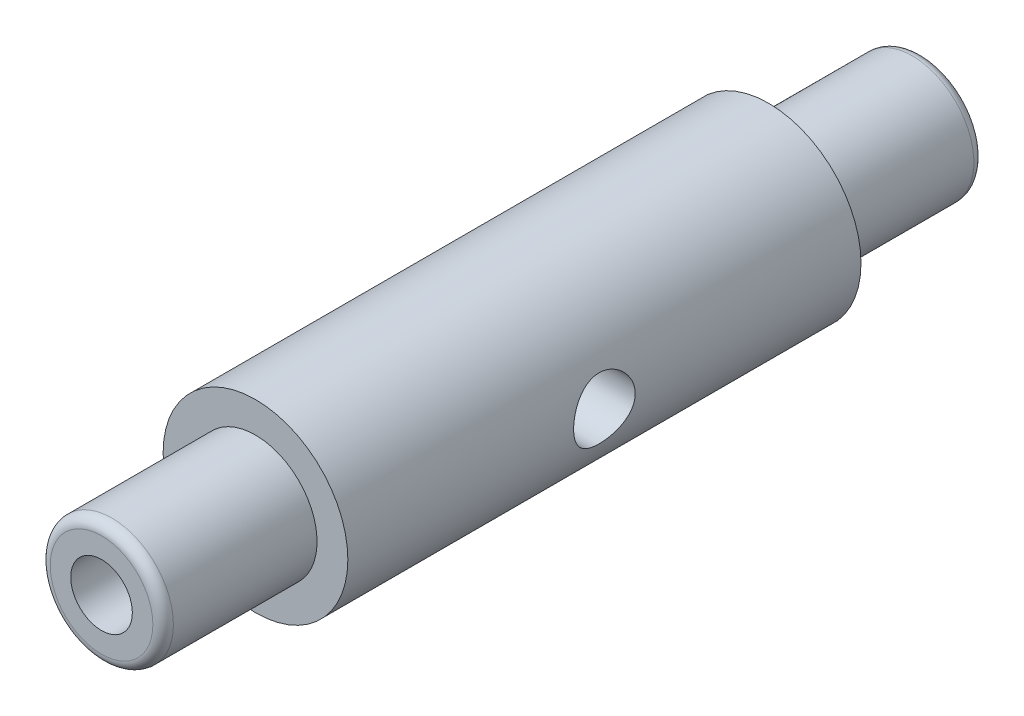
ISO-10303-21;
HEADER;
FILE_DESCRIPTION(('STEP AP214'),'2;1');
FILE_NAME('part.step','',(''),(''),'','','');
FILE_SCHEMA(('AUTOMOTIVE_DESIGN { 1 0 10303 214 1 1 1 1 }'));
ENDSEC;
DATA;
#1=APPLICATION_CONTEXT('core data for automotive mechanical design processes');
#2=APPLICATION_PROTOCOL_DEFINITION('international standard','automotive_design',2000,#1);
#3=PRODUCT_CONTEXT('',#1,'mechanical');
#4=PRODUCT('Part','Part','',(#3));
#5=PRODUCT_RELATED_PRODUCT_CATEGORY('part','',(#4));
#6=PRODUCT_DEFINITION_FORMATION('','',#4);
#7=PRODUCT_DEFINITION_CONTEXT('part definition',#1,'design');
#8=PRODUCT_DEFINITION('design','',#6,#7);
#9=PRODUCT_DEFINITION_SHAPE('','',#8);
#10=(LENGTH_UNIT() NAMED_UNIT(*) SI_UNIT(.MILLI.,.METRE.));
#11=(NAMED_UNIT(*) PLANE_ANGLE_UNIT() SI_UNIT($,.RADIAN.));
#12=(NAMED_UNIT(*) SI_UNIT($,.STERADIAN.) SOLID_ANGLE_UNIT());
#13=UNCERTAINTY_MEASURE_WITH_UNIT(LENGTH_MEASURE(1.E-05),#10,'distance_accuracy_value','');
#14=(GEOMETRIC_REPRESENTATION_CONTEXT(3) GLOBAL_UNCERTAINTY_ASSIGNED_CONTEXT((#13)) GLOBAL_UNIT_ASSIGNED_CONTEXT((#10,
#11,#12)) REPRESENTATION_CONTEXT('',''));
#15=CARTESIAN_POINT('',(0.,0.,0.));
#16=DIRECTION('',(0.,0.,1.));
#17=DIRECTION('',(1.,0.,0.));
#18=AXIS2_PLACEMENT_3D('',#15,#16,#17);
#19=CARTESIAN_POINT('',(0.,0.,40.));
#20=DIRECTION('',(0.,0.,1.));
#21=DIRECTION('',(1.,0.,0.));
#22=AXIS2_PLACEMENT_3D('',#19,#20,#21);
#23=CYLINDRICAL_SURFACE('',#22,3.00000000000001);
#24=CARTESIAN_POINT('',(0.,0.,40.));
#25=DIRECTION('',(0.,0.,1.));
#26=DIRECTION('',(1.,0.,0.));
#27=AXIS2_PLACEMENT_3D('',#24,#25,#26);
#28=CIRCLE('',#27,3.00000000000001);
#29=CARTESIAN_POINT('',(3.00000000000001,0.,40.));
#30=VERTEX_POINT('',#29);
#31=EDGE_CURVE('E115',#30,#30,#28,.T.);
#32=ORIENTED_EDGE('',*,*,#31,.T.);
#33=EDGE_LOOP('',(#32));
#34=FACE_BOUND('',#33,.T.);
#35=CARTESIAN_POINT('',(0.,0.,0.));
#36=DIRECTION('',(-0.707106781186547,0.,0.707106781186547));
#37=DIRECTION('',(0.707106781186547,0.,0.707106781186547));
#38=AXIS2_PLACEMENT_3D('',#35,#36,#37);
#39=ELLIPSE('',#38,4.24264068711929,3.00000000000001);
#40=CARTESIAN_POINT('',(0.,3.00000000000001,0.));
#41=VERTEX_POINT('',#40);
#42=CARTESIAN_POINT('',(0.,-3.00000000000001,0.));
#43=VERTEX_POINT('',#42);
#44=EDGE_CURVE('E59',#41,#43,#39,.F.);
#45=ORIENTED_EDGE('',*,*,#44,.T.);
#46=CARTESIAN_POINT('',(0.,0.,0.));
#47=DIRECTION('',(0.707106781186547,0.,0.707106781186547));
#48=DIRECTION('',(-0.707106781186547,0.,0.707106781186547));
#49=AXIS2_PLACEMENT_3D('',#46,#47,#48);
#50=ELLIPSE('',#49,4.24264068711929,3.00000000000001);
#51=EDGE_CURVE('E11',#43,#41,#50,.F.);
#52=ORIENTED_EDGE('',*,*,#51,.T.);
#53=EDGE_LOOP('',(#45,#52));
#54=FACE_BOUND('',#53,.T.);
#55=ADVANCED_FACE('F45',(#34,#54),#23,.F.);
#56=CARTESIAN_POINT('',(0.,0.,40.));
#57=DIRECTION('',(0.,0.,1.));
#58=DIRECTION('',(1.,0.,0.));
#59=AXIS2_PLACEMENT_3D('',#56,#57,#58);
#60=PLANE('',#59);
#61=ORIENTED_EDGE('',*,*,#31,.F.);
#62=EDGE_LOOP('',(#61));
#63=FACE_BOUND('',#62,.T.);
#64=CARTESIAN_POINT('',(0.,0.,40.));
#65=DIRECTION('',(0.,0.,1.));
#66=DIRECTION('',(1.,0.,0.));
#67=AXIS2_PLACEMENT_3D('',#64,#65,#66);
#68=CIRCLE('',#67,4.99999999999999);
#69=CARTESIAN_POINT('',(4.99999999999999,0.,40.));
#70=VERTEX_POINT('',#69);
#71=EDGE_CURVE('E74',#70,#70,#68,.T.);
#72=ORIENTED_EDGE('',*,*,#71,.T.);
#73=EDGE_LOOP('',(#72));
#74=FACE_BOUND('',#73,.T.);
#75=ADVANCED_FACE('F167',(#63,#74),#60,.T.);
#76=CARTESIAN_POINT('',(0.,0.,-40.));
#77=DIRECTION('',(0.,0.,-1.));
#78=DIRECTION('',(-1.,0.,0.));
#79=AXIS2_PLACEMENT_3D('',#76,#77,#78);
#80=CYLINDRICAL_SURFACE('',#79,5.99999999999999);
#81=CARTESIAN_POINT('',(0.,0.,39.));
#82=DIRECTION('',(0.,0.,1.));
#83=DIRECTION('',(1.,0.,0.));
#84=AXIS2_PLACEMENT_3D('',#81,#82,#83);
#85=CIRCLE('',#84,5.99999999999999);
#86=CARTESIAN_POINT('',(5.99999999999999,0.,39.));
#87=VERTEX_POINT('',#86);
#88=EDGE_CURVE('E83',#87,#87,#85,.F.);
#89=ORIENTED_EDGE('',*,*,#88,.T.);
#90=EDGE_LOOP('',(#89));
#91=FACE_BOUND('',#90,.T.);
#92=CARTESIAN_POINT('',(0.,0.,25.));
#93=DIRECTION('',(0.,0.,-1.));
#94=DIRECTION('',(-1.,0.,0.));
#95=AXIS2_PLACEMENT_3D('',#92,#93,#94);
#96=CIRCLE('',#95,5.99999999999999);
#97=CARTESIAN_POINT('',(-5.99999999999999,0.,25.));
#98=VERTEX_POINT('',#97);
#99=EDGE_CURVE('E95',#98,#98,#96,.T.);
#100=ORIENTED_EDGE('',*,*,#99,.F.);
#101=EDGE_LOOP('',(#100));
#102=FACE_BOUND('',#101,.T.);
#103=ADVANCED_FACE('F172',(#91,#102),#80,.T.);
#104=CARTESIAN_POINT('',(0.,5.99999999999999,25.));
#105=DIRECTION('',(0.,0.,1.));
#106=DIRECTION('',(1.,0.,0.));
#107=AXIS2_PLACEMENT_3D('',#104,#105,#106);
#108=PLANE('',#107);
#109=ORIENTED_EDGE('',*,*,#99,.T.);
#110=EDGE_LOOP('',(#109));
#111=FACE_BOUND('',#110,.T.);
#112=CARTESIAN_POINT('',(0.,0.,25.));
#113=DIRECTION('',(0.,0.,-1.));
#114=DIRECTION('',(-1.,0.,0.));
#115=AXIS2_PLACEMENT_3D('',#112,#113,#114);
#116=CIRCLE('',#115,9.);
#117=CARTESIAN_POINT('',(-9.,0.,25.));
#118=VERTEX_POINT('',#117);
#119=EDGE_CURVE('E99',#118,#118,#116,.T.);
#120=ORIENTED_EDGE('',*,*,#119,.F.);
#121=EDGE_LOOP('',(#120));
#122=FACE_BOUND('',#121,.T.);
#123=ADVANCED_FACE('F163',(#111,#122),#108,.T.);
#124=CARTESIAN_POINT('',(0.,0.,-40.));
#125=DIRECTION('',(0.,0.,-1.));
#126=DIRECTION('',(-1.,0.,0.));
#127=AXIS2_PLACEMENT_3D('',#124,#125,#126);
#128=CYLINDRICAL_SURFACE('',#127,9.);
#129=CARTESIAN_POINT('',(-9.,0.,-3.));
#130=CARTESIAN_POINT('',(-9.00000045902832,-0.16369008866017,-3.00000076119492));
#131=CARTESIAN_POINT('',(-8.99549308522634,-0.32737558361565,-2.98655920161835));
#132=CARTESIAN_POINT('',(-8.97795630609842,-0.649925282618917,-2.93331267354834));
#133=CARTESIAN_POINT('',(-8.96492601606458,-0.808788984356454,-2.89350496815323));
#134=CARTESIAN_POINT('',(-8.93175923719328,-1.11699836850533,-2.78904226984785));
#135=CARTESIAN_POINT('',(-8.9116346319256,-1.2663594776581,-2.72442881262218));
#136=CARTESIAN_POINT('',(-8.86633337152025,-1.55212481041597,-2.57237648148496));
#137=CARTESIAN_POINT('',(-8.84115572003334,-1.68852647087612,-2.4849331049922));
#138=CARTESIAN_POINT('',(-8.78742283329015,-1.9492250250668,-2.28652258542374));
#139=CARTESIAN_POINT('',(-8.75878669391354,-2.07301110089493,-2.17490629721852));
#140=CARTESIAN_POINT('',(-8.70180944349364,-2.30049807810625,-1.9326985358803));
#141=CARTESIAN_POINT('',(-8.67346839871647,-2.40419455646839,-1.80210289521446));
#142=CARTESIAN_POINT('',(-8.61939997431821,-2.59147482668358,-1.52104465441062));
#143=CARTESIAN_POINT('',(-8.59377117827064,-2.6743945746631,-1.37011878080363));
#144=CARTESIAN_POINT('',(-8.54925916255803,-2.81345662163317,-1.05547171662436));
#145=CARTESIAN_POINT('',(-8.53037388482237,-2.8696070921603,-0.891754448511769));
#146=CARTESIAN_POINT('',(-8.50233909808131,-2.95162038452749,-0.561980335509869));
#147=CARTESIAN_POINT('',(-8.49288287308834,-2.97844034481531,-0.396188374532807));
#148=CARTESIAN_POINT('',(-8.48386969888523,-3.00402337000343,-0.0622087375323575));
#149=CARTESIAN_POINT('',(-8.4843096906819,-3.00279510481416,0.105978182127571));
#150=CARTESIAN_POINT('',(-8.4947704502454,-2.97305971111026,0.431809891332064));
#151=CARTESIAN_POINT('',(-8.50435247602599,-2.94580173950098,0.589585208757057));
#152=CARTESIAN_POINT('',(-8.53129973173653,-2.86681848854825,0.898180258820504));
#153=CARTESIAN_POINT('',(-8.54866589352323,-2.81509027977561,1.04899915630521));
#154=CARTESIAN_POINT('',(-8.58953733393746,-2.68781717418063,1.34223824877444));
#155=CARTESIAN_POINT('',(-8.61313697379352,-2.61190214612179,1.48448407640858));
#156=CARTESIAN_POINT('',(-8.66377675727179,-2.43866731890942,1.75461272483918));
#157=CARTESIAN_POINT('',(-8.69081789371391,-2.34134133709202,1.88249138080014));
#158=CARTESIAN_POINT('',(-8.74701987503223,-2.12204799804671,2.12727479448232));
#159=CARTESIAN_POINT('',(-8.77621768064528,-1.99905945022893,2.24325808352721));
#160=CARTESIAN_POINT('',(-8.8322081516111,-1.73501870991019,2.45319379999019));
#161=CARTESIAN_POINT('',(-8.85900058614202,-1.59396478698244,2.54714411449349));
#162=CARTESIAN_POINT('',(-8.90751323813381,-1.2958428391388,2.71108890070521));
#163=CARTESIAN_POINT('',(-8.92918050024118,-1.13862982924901,2.7808364740222));
#164=CARTESIAN_POINT('',(-8.96461701433304,-0.813807250093523,2.89260952186713));
#165=CARTESIAN_POINT('',(-8.97838900964638,-0.646201314464861,2.93464462627031));
#166=CARTESIAN_POINT('',(-8.99602881214321,-0.313151488587913,2.98816699806708));
#167=CARTESIAN_POINT('',(-9.00030005501184,-0.147928799594539,3.00089942751825));
#168=CARTESIAN_POINT('',(-8.99966708084482,0.182325209880712,2.99900197920459));
#169=CARTESIAN_POINT('',(-8.99476441258087,0.347356557958951,2.98437672006037));
#170=CARTESIAN_POINT('',(-8.97660074151313,0.667559598912766,2.92916427679212));
#171=CARTESIAN_POINT('',(-8.96358596133577,0.822878420504529,2.88934138185152));
#172=CARTESIAN_POINT('',(-8.9307554049021,1.12456787573872,2.78581966659982));
#173=CARTESIAN_POINT('',(-8.91093876140025,1.27093736552582,2.72211780159664));
#174=CARTESIAN_POINT('',(-8.86586793861869,1.55486488917982,2.57078870447764));
#175=CARTESIAN_POINT('',(-8.84048444267358,1.69208987765144,2.48257622015049));
#176=CARTESIAN_POINT('',(-8.78715761748787,1.95019449040676,2.28541754995955));
#177=CARTESIAN_POINT('',(-8.75921350781483,2.07106910338673,2.17646503190471));
#178=CARTESIAN_POINT('',(-8.70230543941334,2.2987575234189,1.93506374698024));
#179=CARTESIAN_POINT('',(-8.67335283262284,2.40468290773731,1.80177231921942));
#180=CARTESIAN_POINT('',(-8.61899919884126,2.59277256697072,1.51868529656734));
#181=CARTESIAN_POINT('',(-8.59359820146007,2.67493664379304,1.36888956409777));
#182=CARTESIAN_POINT('',(-8.54947175374151,2.81279079124908,1.05698095413031));
#183=CARTESIAN_POINT('',(-8.53073282378936,2.86853439649506,0.894893762493703));
#184=CARTESIAN_POINT('',(-8.50232496919349,2.95168400027807,0.562864049867609));
#185=CARTESIAN_POINT('',(-8.49265195870918,2.97910276486182,0.392925103786952));
#186=CARTESIAN_POINT('',(-8.48393576622531,3.00382884743203,0.0594087118772512));
#187=CARTESIAN_POINT('',(-8.48437200772245,3.0026107719252,-0.10404702086047));
#188=CARTESIAN_POINT('',(-8.49453809471602,2.97372688034608,-0.428295224766187));
#189=CARTESIAN_POINT('',(-8.50426738708085,2.94606263837576,-0.589087853865265));
#190=CARTESIAN_POINT('',(-8.53153572914675,2.86611543938804,-0.900406989007417));
#191=CARTESIAN_POINT('',(-8.54892294067433,2.81431003804654,-1.05107047501349));
#192=CARTESIAN_POINT('',(-8.58949196455405,2.68793809727924,-1.34168222081481));
#193=CARTESIAN_POINT('',(-8.61267506290179,2.61336650566142,-1.48162809356402));
#194=CARTESIAN_POINT('',(-8.66348487678139,2.43978207775029,-1.75345100976873));
#195=CARTESIAN_POINT('',(-8.69126134926411,2.33984472829374,-1.88470950569516));
#196=CARTESIAN_POINT('',(-8.74750068849758,2.11992864940695,-2.1290694401526));
#197=CARTESIAN_POINT('',(-8.77596374737117,1.99994425335445,-2.24216572706422));
#198=CARTESIAN_POINT('',(-8.83170091576632,1.73772467076207,-2.45143323686754));
#199=CARTESIAN_POINT('',(-8.8588854540377,1.59480454049919,-2.546773043253));
#200=CARTESIAN_POINT('',(-8.90777973517836,1.29407207221987,-2.71197128655194));
#201=CARTESIAN_POINT('',(-8.9294908772379,1.13626355439705,-2.78183623776613));
#202=CARTESIAN_POINT('',(-8.96416545205626,0.817480941602928,-2.89116489746602));
#203=CARTESIAN_POINT('',(-8.97747637267568,0.656963273029225,-2.93184739879013));
#204=CARTESIAN_POINT('',(-8.99539221192665,0.33096124803074,-2.98626084203138));
#205=CARTESIAN_POINT('',(-8.99999953595715,0.165478276706239,-2.99999923048961));
#206=CARTESIAN_POINT('',(-9.,0.,-3.));
#207=B_SPLINE_CURVE_WITH_KNOTS('',3,(#129,#130,#131,#132,#133,#134,#135,#136,#137,#138,#139,
#140,#141,#142,#143,#144,#145,#146,#147,#148,#149,#150,#151,#152,#153,#154,#155,#156,#157,#158,
#159,#160,#161,#162,#163,#164,#165,#166,#167,#168,#169,#170,#171,#172,#173,#174,#175,#176,#177,
#178,#179,#180,#181,#182,#183,#184,#185,#186,#187,#188,#189,#190,#191,#192,#193,#194,#195,#196,
#197,#198,#199,#200,#201,#202,#203,#204,#205,#206),.UNSPECIFIED.,.T.,.F.,(4,2,2,2,2,2,2,2,2,2,2,
2,2,2,2,2,2,2,2,2,2,2,2,2,2,2,2,2,2,2,2,2,2,2,2,2,2,2,4),(0.,0.490461318078033,
0.980973555802563,1.47066801861082,1.9604591333973,2.46554052848268,2.97073299862591,
3.49045154470411,4.010011340785,4.5120577722552,5.01394901962456,5.49290479653841,
5.97191792566446,6.45864513465392,6.94551307674622,7.45779917434101,7.97013437899855,
8.48755216951073,9.00479006631625,9.49960749525509,9.9943413949253,10.4747447393464,
10.9552093585231,11.4483119953121,11.9415654246567,12.4572306864226,12.9729002470499,
13.4875204148031,14.0019085411752,14.4898699819278,14.9778023805413,15.4564676124125,
15.9352391452793,16.4349020007541,16.9347063337134,17.453989825053,17.9731404345737,
18.4690967512144,18.9649159811442),.UNSPECIFIED.);
#208=CARTESIAN_POINT('',(-9.,0.,-3.));
#209=VERTEX_POINT('',#208);
#210=EDGE_CURVE('E119',#209,#209,#207,.T.);
#211=ORIENTED_EDGE('',*,*,#210,.F.);
#212=EDGE_LOOP('',(#211));
#213=FACE_BOUND('',#212,.T.);
#214=CARTESIAN_POINT('',(9.,0.,-3.));
#215=CARTESIAN_POINT('',(9.00000045902832,0.16369008866017,-3.00000076119492));
#216=CARTESIAN_POINT('',(8.99549308522634,0.32737558361565,-2.98655920161835));
#217=CARTESIAN_POINT('',(8.97795630609842,0.649925282618917,-2.93331267354834));
#218=CARTESIAN_POINT('',(8.96492601606458,0.808788984356454,-2.89350496815323));
#219=CARTESIAN_POINT('',(8.93175923719328,1.11699836850533,-2.78904226984785));
#220=CARTESIAN_POINT('',(8.9116346319256,1.2663594776581,-2.72442881262218));
#221=CARTESIAN_POINT('',(8.86633337152025,1.55212481041597,-2.57237648148496));
#222=CARTESIAN_POINT('',(8.84115572003334,1.68852647087612,-2.4849331049922));
#223=CARTESIAN_POINT('',(8.78742283329015,1.9492250250668,-2.28652258542374));
#224=CARTESIAN_POINT('',(8.75878669391354,2.07301110089493,-2.17490629721852));
#225=CARTESIAN_POINT('',(8.70180944349364,2.30049807810625,-1.9326985358803));
#226=CARTESIAN_POINT('',(8.67346839871647,2.40419455646839,-1.80210289521446));
#227=CARTESIAN_POINT('',(8.61939997431821,2.59147482668358,-1.52104465441062));
#228=CARTESIAN_POINT('',(8.59377117827064,2.6743945746631,-1.37011878080363));
#229=CARTESIAN_POINT('',(8.54925916255803,2.81345662163317,-1.05547171662436));
#230=CARTESIAN_POINT('',(8.53037388482237,2.8696070921603,-0.891754448511769));
#231=CARTESIAN_POINT('',(8.50233909808131,2.95162038452749,-0.561980335509869));
#232=CARTESIAN_POINT('',(8.49288287308834,2.97844034481531,-0.396188374532807));
#233=CARTESIAN_POINT('',(8.48386969888523,3.00402337000343,-0.0622087375323575));
#234=CARTESIAN_POINT('',(8.4843096906819,3.00279510481416,0.105978182127571));
#235=CARTESIAN_POINT('',(8.4947704502454,2.97305971111026,0.431809891332064));
#236=CARTESIAN_POINT('',(8.50435247602599,2.94580173950098,0.589585208757057));
#237=CARTESIAN_POINT('',(8.53129973173653,2.86681848854825,0.898180258820504));
#238=CARTESIAN_POINT('',(8.54866589352323,2.81509027977561,1.04899915630521));
#239=CARTESIAN_POINT('',(8.58953733393746,2.68781717418063,1.34223824877444));
#240=CARTESIAN_POINT('',(8.61313697379352,2.61190214612179,1.48448407640858));
#241=CARTESIAN_POINT('',(8.66377675727179,2.43866731890942,1.75461272483918));
#242=CARTESIAN_POINT('',(8.69081789371391,2.34134133709202,1.88249138080014));
#243=CARTESIAN_POINT('',(8.74701987503223,2.12204799804671,2.12727479448232));
#244=CARTESIAN_POINT('',(8.77621768064528,1.99905945022893,2.24325808352721));
#245=CARTESIAN_POINT('',(8.8322081516111,1.73501870991019,2.45319379999019));
#246=CARTESIAN_POINT('',(8.85900058614202,1.59396478698244,2.54714411449349));
#247=CARTESIAN_POINT('',(8.90751323813381,1.2958428391388,2.71108890070521));
#248=CARTESIAN_POINT('',(8.92918050024118,1.13862982924901,2.7808364740222));
#249=CARTESIAN_POINT('',(8.96461701433304,0.813807250093523,2.89260952186713));
#250=CARTESIAN_POINT('',(8.97838900964638,0.646201314464861,2.93464462627031));
#251=CARTESIAN_POINT('',(8.99602881214321,0.313151488587913,2.98816699806708));
#252=CARTESIAN_POINT('',(9.00030005501184,0.147928799594539,3.00089942751825));
#253=CARTESIAN_POINT('',(8.99966708084482,-0.182325209880712,2.99900197920459));
#254=CARTESIAN_POINT('',(8.99476441258087,-0.347356557958951,2.98437672006037));
#255=CARTESIAN_POINT('',(8.97660074151313,-0.667559598912766,2.92916427679212));
#256=CARTESIAN_POINT('',(8.96358596133577,-0.822878420504529,2.88934138185152));
#257=CARTESIAN_POINT('',(8.9307554049021,-1.12456787573872,2.78581966659982));
#258=CARTESIAN_POINT('',(8.91093876140025,-1.27093736552582,2.72211780159664));
#259=CARTESIAN_POINT('',(8.86586793861869,-1.55486488917982,2.57078870447764));
#260=CARTESIAN_POINT('',(8.84048444267358,-1.69208987765144,2.48257622015049));
#261=CARTESIAN_POINT('',(8.78715761748787,-1.95019449040676,2.28541754995955));
#262=CARTESIAN_POINT('',(8.75921350781483,-2.07106910338673,2.17646503190471));
#263=CARTESIAN_POINT('',(8.70230543941334,-2.2987575234189,1.93506374698024));
#264=CARTESIAN_POINT('',(8.67335283262284,-2.40468290773731,1.80177231921942));
#265=CARTESIAN_POINT('',(8.61899919884126,-2.59277256697072,1.51868529656734));
#266=CARTESIAN_POINT('',(8.59359820146007,-2.67493664379304,1.36888956409777));
#267=CARTESIAN_POINT('',(8.54947175374151,-2.81279079124908,1.05698095413031));
#268=CARTESIAN_POINT('',(8.53073282378936,-2.86853439649506,0.894893762493703));
#269=CARTESIAN_POINT('',(8.50232496919349,-2.95168400027807,0.562864049867609));
#270=CARTESIAN_POINT('',(8.49265195870918,-2.97910276486182,0.392925103786952));
#271=CARTESIAN_POINT('',(8.48393576622531,-3.00382884743203,0.0594087118772512));
#272=CARTESIAN_POINT('',(8.48437200772245,-3.0026107719252,-0.10404702086047));
#273=CARTESIAN_POINT('',(8.49453809471602,-2.97372688034608,-0.428295224766187));
#274=CARTESIAN_POINT('',(8.50426738708085,-2.94606263837576,-0.589087853865265));
#275=CARTESIAN_POINT('',(8.53153572914675,-2.86611543938804,-0.900406989007417));
#276=CARTESIAN_POINT('',(8.54892294067433,-2.81431003804654,-1.05107047501349));
#277=CARTESIAN_POINT('',(8.58949196455405,-2.68793809727924,-1.34168222081481));
#278=CARTESIAN_POINT('',(8.61267506290179,-2.61336650566142,-1.48162809356402));
#279=CARTESIAN_POINT('',(8.66348487678139,-2.43978207775029,-1.75345100976873));
#280=CARTESIAN_POINT('',(8.69126134926411,-2.33984472829374,-1.88470950569516));
#281=CARTESIAN_POINT('',(8.74750068849758,-2.11992864940695,-2.1290694401526));
#282=CARTESIAN_POINT('',(8.77596374737117,-1.99994425335445,-2.24216572706422));
#283=CARTESIAN_POINT('',(8.83170091576632,-1.73772467076207,-2.45143323686754));
#284=CARTESIAN_POINT('',(8.8588854540377,-1.59480454049919,-2.546773043253));
#285=CARTESIAN_POINT('',(8.90777973517836,-1.29407207221987,-2.71197128655194));
#286=CARTESIAN_POINT('',(8.9294908772379,-1.13626355439705,-2.78183623776613));
#287=CARTESIAN_POINT('',(8.96416545205626,-0.817480941602928,-2.89116489746602));
#288=CARTESIAN_POINT('',(8.97747637267568,-0.656963273029225,-2.93184739879013));
#289=CARTESIAN_POINT('',(8.99539221192665,-0.33096124803074,-2.98626084203138));
#290=CARTESIAN_POINT('',(8.99999953595715,-0.165478276706239,-2.99999923048961));
#291=CARTESIAN_POINT('',(9.,0.,-3.));
#292=B_SPLINE_CURVE_WITH_KNOTS('',3,(#214,#215,#216,#217,#218,#219,#220,#221,#222,#223,#224,
#225,#226,#227,#228,#229,#230,#231,#232,#233,#234,#235,#236,#237,#238,#239,#240,#241,#242,#243,
#244,#245,#246,#247,#248,#249,#250,#251,#252,#253,#254,#255,#256,#257,#258,#259,#260,#261,#262,
#263,#264,#265,#266,#267,#268,#269,#270,#271,#272,#273,#274,#275,#276,#277,#278,#279,#280,#281,
#282,#283,#284,#285,#286,#287,#288,#289,#290,#291),.UNSPECIFIED.,.T.,.F.,(4,2,2,2,2,2,2,2,2,2,2,
2,2,2,2,2,2,2,2,2,2,2,2,2,2,2,2,2,2,2,2,2,2,2,2,2,2,2,4),(0.,0.490461318078033,
0.980973555802563,1.47066801861082,1.9604591333973,2.46554052848268,2.97073299862591,
3.49045154470411,4.010011340785,4.5120577722552,5.01394901962456,5.49290479653841,
5.97191792566446,6.45864513465392,6.94551307674622,7.45779917434101,7.97013437899855,
8.48755216951073,9.00479006631625,9.49960749525509,9.9943413949253,10.4747447393464,
10.9552093585231,11.4483119953121,11.9415654246567,12.4572306864226,12.9729002470499,
13.4875204148031,14.0019085411752,14.4898699819278,14.9778023805413,15.4564676124125,
15.9352391452793,16.4349020007541,16.9347063337134,17.453989825053,17.9731404345737,
18.4690967512144,18.9649159811442),.UNSPECIFIED.);
#293=CARTESIAN_POINT('',(9.,0.,-3.));
#294=VERTEX_POINT('',#293);
#295=EDGE_CURVE('E128',#294,#294,#292,.T.);
#296=ORIENTED_EDGE('',*,*,#295,.F.);
#297=EDGE_LOOP('',(#296));
#298=FACE_BOUND('',#297,.T.);
#299=ORIENTED_EDGE('',*,*,#119,.T.);
#300=EDGE_LOOP('',(#299));
#301=FACE_BOUND('',#300,.T.);
#302=CARTESIAN_POINT('',(0.,0.,-25.));
#303=DIRECTION('',(0.,0.,-1.));
#304=DIRECTION('',(-1.,0.,0.));
#305=AXIS2_PLACEMENT_3D('',#302,#303,#304);
#306=CIRCLE('',#305,9.);
#307=CARTESIAN_POINT('',(-9.,0.,-25.));
#308=VERTEX_POINT('',#307);
#309=EDGE_CURVE('E103',#308,#308,#306,.T.);
#310=ORIENTED_EDGE('',*,*,#309,.F.);
#311=EDGE_LOOP('',(#310));
#312=FACE_BOUND('',#311,.T.);
#313=ADVANCED_FACE('F132',(#213,#298,#301,#312),#128,.T.);
#314=CARTESIAN_POINT('',(0.,9.,-25.));
#315=DIRECTION('',(0.,0.,-1.));
#316=DIRECTION('',(-1.,0.,0.));
#317=AXIS2_PLACEMENT_3D('',#314,#315,#316);
#318=PLANE('',#317);
#319=ORIENTED_EDGE('',*,*,#309,.T.);
#320=EDGE_LOOP('',(#319));
#321=FACE_BOUND('',#320,.T.);
#322=CARTESIAN_POINT('',(0.,0.,-25.));
#323=DIRECTION('',(0.,0.,-1.));
#324=DIRECTION('',(-1.,0.,0.));
#325=AXIS2_PLACEMENT_3D('',#322,#323,#324);
#326=CIRCLE('',#325,5.99999999999999);
#327=CARTESIAN_POINT('',(-5.99999999999999,0.,-25.));
#328=VERTEX_POINT('',#327);
#329=EDGE_CURVE('E107',#328,#328,#326,.T.);
#330=ORIENTED_EDGE('',*,*,#329,.F.);
#331=EDGE_LOOP('',(#330));
#332=FACE_BOUND('',#331,.T.);
#333=ADVANCED_FACE('F154',(#321,#332),#318,.T.);
#334=CARTESIAN_POINT('',(0.,0.,-40.));
#335=DIRECTION('',(0.,0.,-1.));
#336=DIRECTION('',(-1.,0.,0.));
#337=AXIS2_PLACEMENT_3D('',#334,#335,#336);
#338=CYLINDRICAL_SURFACE('',#337,5.99999999999999);
#339=CARTESIAN_POINT('',(0.,0.,-39.));
#340=DIRECTION('',(0.,0.,-1.));
#341=DIRECTION('',(-1.,0.,0.));
#342=AXIS2_PLACEMENT_3D('',#339,#340,#341);
#343=CIRCLE('',#342,5.99999999999999);
#344=CARTESIAN_POINT('',(-5.99999999999999,0.,-39.));
#345=VERTEX_POINT('',#344);
#346=EDGE_CURVE('E87',#345,#345,#343,.F.);
#347=ORIENTED_EDGE('',*,*,#346,.T.);
#348=EDGE_LOOP('',(#347));
#349=FACE_BOUND('',#348,.T.);
#350=ORIENTED_EDGE('',*,*,#329,.T.);
#351=EDGE_LOOP('',(#350));
#352=FACE_BOUND('',#351,.T.);
#353=ADVANCED_FACE('F151',(#349,#352),#338,.T.);
#354=CARTESIAN_POINT('',(0.,5.99999999999999,-40.));
#355=DIRECTION('',(0.,0.,-1.));
#356=DIRECTION('',(-1.,0.,0.));
#357=AXIS2_PLACEMENT_3D('',#354,#355,#356);
#358=PLANE('',#357);
#359=CARTESIAN_POINT('',(0.,0.,-40.));
#360=DIRECTION('',(0.,0.,-1.));
#361=DIRECTION('',(-1.,0.,0.));
#362=AXIS2_PLACEMENT_3D('',#359,#360,#361);
#363=CIRCLE('',#362,4.99999999999999);
#364=CARTESIAN_POINT('',(-4.99999999999999,0.,-40.));
#365=VERTEX_POINT('',#364);
#366=EDGE_CURVE('E91',#365,#365,#363,.T.);
#367=ORIENTED_EDGE('',*,*,#366,.T.);
#368=EDGE_LOOP('',(#367));
#369=FACE_BOUND('',#368,.T.);
#370=ADVANCED_FACE('F147',(#369),#358,.T.);
#371=CARTESIAN_POINT('',(0.,0.,-39.));
#372=DIRECTION('',(0.,0.,-1.));
#373=DIRECTION('',(-1.,0.,0.));
#374=AXIS2_PLACEMENT_3D('',#371,#372,#373);
#375=TOROIDAL_SURFACE('',#374,4.99999999999999,1.);
#376=ORIENTED_EDGE('',*,*,#346,.F.);
#377=EDGE_LOOP('',(#376));
#378=FACE_BOUND('',#377,.T.);
#379=ORIENTED_EDGE('',*,*,#366,.F.);
#380=EDGE_LOOP('',(#379));
#381=FACE_BOUND('',#380,.T.);
#382=ADVANCED_FACE('F150',(#378,#381),#375,.T.);
#383=CARTESIAN_POINT('',(0.,0.,39.));
#384=DIRECTION('',(0.,0.,1.));
#385=DIRECTION('',(1.,0.,0.));
#386=AXIS2_PLACEMENT_3D('',#383,#384,#385);
#387=TOROIDAL_SURFACE('',#386,4.99999999999999,1.);
#388=ORIENTED_EDGE('',*,*,#71,.F.);
#389=EDGE_LOOP('',(#388));
#390=FACE_BOUND('',#389,.T.);
#391=ORIENTED_EDGE('',*,*,#88,.F.);
#392=EDGE_LOOP('',(#391));
#393=FACE_BOUND('',#392,.T.);
#394=ADVANCED_FACE('F47',(#390,#393),#387,.T.);
#395=CARTESIAN_POINT('',(-9.,0.,0.));
#396=DIRECTION('',(1.,0.,0.));
#397=DIRECTION('',(0.,0.,-1.));
#398=AXIS2_PLACEMENT_3D('',#395,#396,#397);
#399=CYLINDRICAL_SURFACE('',#398,3.);
#400=ORIENTED_EDGE('',*,*,#295,.T.);
#401=EDGE_LOOP('',(#400));
#402=FACE_BOUND('',#401,.T.);
#403=ORIENTED_EDGE('',*,*,#44,.F.);
#404=CARTESIAN_POINT('',(0.,0.,0.));
#405=DIRECTION('',(0.707106781186547,0.,0.707106781186547));
#406=DIRECTION('',(-0.707106781186547,0.,0.707106781186547));
#407=AXIS2_PLACEMENT_3D('',#404,#405,#406);
#408=ELLIPSE('',#407,4.24264068711929,3.00000000000001);
#409=EDGE_CURVE('E54',#43,#41,#408,.T.);
#410=ORIENTED_EDGE('',*,*,#409,.F.);
#411=EDGE_LOOP('',(#403,#410));
#412=FACE_BOUND('',#411,.T.);
#413=ADVANCED_FACE('F72',(#402,#412),#399,.F.);
#414=CARTESIAN_POINT('',(0.,0.,-5.));
#415=DIRECTION('',(0.,0.,-1.));
#416=DIRECTION('',(-1.,0.,0.));
#417=AXIS2_PLACEMENT_3D('',#414,#415,#416);
#418=PLANE('',#417);
#419=CARTESIAN_POINT('',(0.,0.,-5.));
#420=DIRECTION('',(0.,0.,1.));
#421=DIRECTION('',(1.,0.,0.));
#422=AXIS2_PLACEMENT_3D('',#419,#420,#421);
#423=CIRCLE('',#422,3.00000000000001);
#424=CARTESIAN_POINT('',(3.00000000000001,0.,-5.));
#425=VERTEX_POINT('',#424);
#426=EDGE_CURVE('E111',#425,#425,#423,.T.);
#427=ORIENTED_EDGE('',*,*,#426,.T.);
#428=EDGE_LOOP('',(#427));
#429=FACE_BOUND('',#428,.T.);
#430=ADVANCED_FACE('F143',(#429),#418,.F.);
#431=CARTESIAN_POINT('',(0.,0.,0.));
#432=DIRECTION('',(-0.707106781186547,0.,0.707106781186547));
#433=DIRECTION('',(0.707106781186547,0.,0.707106781186547));
#434=AXIS2_PLACEMENT_3D('',#431,#432,#433);
#435=ELLIPSE('',#434,4.24264068711929,3.00000000000001);
#436=EDGE_CURVE('E65',#41,#43,#435,.T.);
#437=ORIENTED_EDGE('',*,*,#436,.T.);
#438=ORIENTED_EDGE('',*,*,#409,.T.);
#439=EDGE_LOOP('',(#437,#438));
#440=FACE_BOUND('',#439,.T.);
#441=ORIENTED_EDGE('',*,*,#426,.F.);
#442=EDGE_LOOP('',(#441));
#443=FACE_BOUND('',#442,.T.);
#444=ADVANCED_FACE('F76',(#440,#443),#23,.F.);
#445=ORIENTED_EDGE('',*,*,#210,.T.);
#446=EDGE_LOOP('',(#445));
#447=FACE_BOUND('',#446,.T.);
#448=ORIENTED_EDGE('',*,*,#436,.F.);
#449=ORIENTED_EDGE('',*,*,#51,.F.);
#450=EDGE_LOOP('',(#448,#449));
#451=FACE_BOUND('',#450,.T.);
#452=ADVANCED_FACE('F66',(#447,#451),#399,.F.);
#453=CLOSED_SHELL('',(#55,#75,#103,#123,#313,#333,#353,#370,#382,#394,#413,#430,#444,#452));
#454=MANIFOLD_SOLID_BREP('B2',#453);
#455=ADVANCED_BREP_SHAPE_REPRESENTATION('',(#18,#454),#14);
#456=SHAPE_DEFINITION_REPRESENTATION(#9,#455);
ENDSEC;
END-ISO-10303-21;
